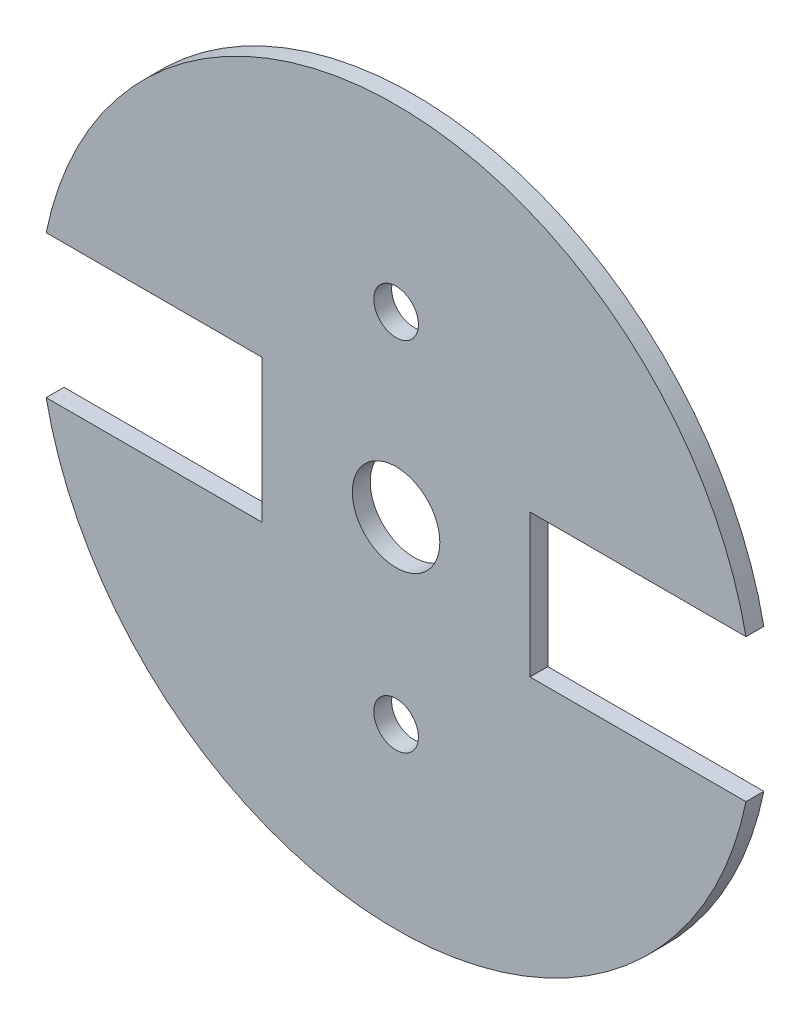
ISO-10303-21;
HEADER;
FILE_DESCRIPTION(('STEP AP214'),'2;1');
FILE_NAME('part.step','',(''),(''),'','','');
FILE_SCHEMA(('AUTOMOTIVE_DESIGN { 1 0 10303 214 1 1 1 1 }'));
ENDSEC;
DATA;
#1=APPLICATION_CONTEXT('core data for automotive mechanical design processes');
#2=APPLICATION_PROTOCOL_DEFINITION('international standard','automotive_design',2000,#1);
#3=PRODUCT_CONTEXT('',#1,'mechanical');
#4=PRODUCT('Part','Part','',(#3));
#5=PRODUCT_RELATED_PRODUCT_CATEGORY('part','',(#4));
#6=PRODUCT_DEFINITION_FORMATION('','',#4);
#7=PRODUCT_DEFINITION_CONTEXT('part definition',#1,'design');
#8=PRODUCT_DEFINITION('design','',#6,#7);
#9=PRODUCT_DEFINITION_SHAPE('','',#8);
#10=(LENGTH_UNIT() NAMED_UNIT(*) SI_UNIT(.MILLI.,.METRE.));
#11=(NAMED_UNIT(*) PLANE_ANGLE_UNIT() SI_UNIT($,.RADIAN.));
#12=(NAMED_UNIT(*) SI_UNIT($,.STERADIAN.) SOLID_ANGLE_UNIT());
#13=UNCERTAINTY_MEASURE_WITH_UNIT(LENGTH_MEASURE(1.E-05),#10,'distance_accuracy_value','');
#14=(GEOMETRIC_REPRESENTATION_CONTEXT(3) GLOBAL_UNCERTAINTY_ASSIGNED_CONTEXT((#13)) GLOBAL_UNIT_ASSIGNED_CONTEXT((#10,
#11,#12)) REPRESENTATION_CONTEXT('',''));
#15=CARTESIAN_POINT('',(0.,0.,0.));
#16=DIRECTION('',(0.,0.,1.));
#17=DIRECTION('',(1.,0.,0.));
#18=AXIS2_PLACEMENT_3D('',#15,#16,#17);
#19=CARTESIAN_POINT('',(0.,0.,2.));
#20=DIRECTION('',(0.,0.,1.));
#21=DIRECTION('',(1.,0.,0.));
#22=AXIS2_PLACEMENT_3D('',#19,#20,#21);
#23=PLANE('',#22);
#24=CARTESIAN_POINT('',(0.,19.9087203247168,2.));
#25=DIRECTION('',(0.,0.,1.));
#26=DIRECTION('',(1.,0.,0.));
#27=AXIS2_PLACEMENT_3D('',#24,#25,#26);
#28=CIRCLE('',#27,2.5);
#29=CARTESIAN_POINT('',(2.5,19.9087203247168,2.));
#30=VERTEX_POINT('',#29);
#31=EDGE_CURVE('E182',#30,#30,#28,.T.);
#32=ORIENTED_EDGE('',*,*,#31,.F.);
#33=EDGE_LOOP('',(#32));
#34=FACE_BOUND('',#33,.T.);
#35=CARTESIAN_POINT('',(0.,0.,2.));
#36=DIRECTION('',(0.,0.,1.));
#37=DIRECTION('',(1.,0.,0.));
#38=AXIS2_PLACEMENT_3D('',#35,#36,#37);
#39=CIRCLE('',#38,40.);
#40=CARTESIAN_POINT('',(39.1918358845309,8.,2.));
#41=VERTEX_POINT('',#40);
#42=CARTESIAN_POINT('',(-39.1918358845309,8.,2.));
#43=VERTEX_POINT('',#42);
#44=EDGE_CURVE('E145',#41,#43,#39,.T.);
#45=ORIENTED_EDGE('',*,*,#44,.T.);
#46=DIRECTION('',(1.,0.,0.));
#47=VECTOR('',#46,1.);
#48=CARTESIAN_POINT('',(-15.,8.,2.));
#49=LINE('',#48,#47);
#50=CARTESIAN_POINT('',(-15.,8.,2.));
#51=VERTEX_POINT('',#50);
#52=EDGE_CURVE('E93',#43,#51,#49,.T.);
#53=ORIENTED_EDGE('',*,*,#52,.T.);
#54=DIRECTION('',(0.,-1.,0.));
#55=VECTOR('',#54,1.);
#56=CARTESIAN_POINT('',(-15.,8.,2.));
#57=LINE('',#56,#55);
#58=CARTESIAN_POINT('',(-15.,-8.,2.));
#59=VERTEX_POINT('',#58);
#60=EDGE_CURVE('E160',#51,#59,#57,.T.);
#61=ORIENTED_EDGE('',*,*,#60,.T.);
#62=DIRECTION('',(-1.,0.,0.));
#63=VECTOR('',#62,1.);
#64=CARTESIAN_POINT('',(-15.,-8.,2.));
#65=LINE('',#64,#63);
#66=CARTESIAN_POINT('',(-39.1918358845309,-7.99999999999998,2.));
#67=VERTEX_POINT('',#66);
#68=EDGE_CURVE('E173',#59,#67,#65,.T.);
#69=ORIENTED_EDGE('',*,*,#68,.T.);
#70=CARTESIAN_POINT('',(0.,0.,2.));
#71=DIRECTION('',(0.,0.,1.));
#72=DIRECTION('',(1.,0.,0.));
#73=AXIS2_PLACEMENT_3D('',#70,#71,#72);
#74=CIRCLE('',#73,40.);
#75=CARTESIAN_POINT('',(39.1918358845309,-8.,2.));
#76=VERTEX_POINT('',#75);
#77=EDGE_CURVE('E112',#67,#76,#74,.T.);
#78=ORIENTED_EDGE('',*,*,#77,.T.);
#79=DIRECTION('',(-1.,0.,0.));
#80=VECTOR('',#79,1.);
#81=CARTESIAN_POINT('',(15.,-8.,2.));
#82=LINE('',#81,#80);
#83=CARTESIAN_POINT('',(15.,-8.,2.));
#84=VERTEX_POINT('',#83);
#85=EDGE_CURVE('E106',#76,#84,#82,.T.);
#86=ORIENTED_EDGE('',*,*,#85,.T.);
#87=DIRECTION('',(0.,1.,0.));
#88=VECTOR('',#87,1.);
#89=CARTESIAN_POINT('',(15.,8.,2.));
#90=LINE('',#89,#88);
#91=CARTESIAN_POINT('',(15.,8.,2.));
#92=VERTEX_POINT('',#91);
#93=EDGE_CURVE('E110',#84,#92,#90,.T.);
#94=ORIENTED_EDGE('',*,*,#93,.T.);
#95=DIRECTION('',(1.,0.,0.));
#96=VECTOR('',#95,1.);
#97=CARTESIAN_POINT('',(15.,8.,2.));
#98=LINE('',#97,#96);
#99=EDGE_CURVE('E50',#92,#41,#98,.T.);
#100=ORIENTED_EDGE('',*,*,#99,.T.);
#101=EDGE_LOOP('',(#45,#53,#61,#69,#78,#86,#94,#100));
#102=FACE_BOUND('',#101,.T.);
#103=CARTESIAN_POINT('',(0.,0.,2.));
#104=DIRECTION('',(0.,0.,1.));
#105=DIRECTION('',(1.,0.,0.));
#106=AXIS2_PLACEMENT_3D('',#103,#104,#105);
#107=CIRCLE('',#106,4.9);
#108=CARTESIAN_POINT('',(4.9,0.,2.));
#109=VERTEX_POINT('',#108);
#110=EDGE_CURVE('E134',#109,#109,#107,.T.);
#111=ORIENTED_EDGE('',*,*,#110,.F.);
#112=EDGE_LOOP('',(#111));
#113=FACE_BOUND('',#112,.T.);
#114=CARTESIAN_POINT('',(0.,-20.0912796752832,2.));
#115=DIRECTION('',(0.,0.,1.));
#116=DIRECTION('',(1.,0.,0.));
#117=AXIS2_PLACEMENT_3D('',#114,#115,#116);
#118=CIRCLE('',#117,2.5);
#119=CARTESIAN_POINT('',(2.5,-20.0912796752832,2.));
#120=VERTEX_POINT('',#119);
#121=EDGE_CURVE('E188',#120,#120,#118,.T.);
#122=ORIENTED_EDGE('',*,*,#121,.F.);
#123=EDGE_LOOP('',(#122));
#124=FACE_BOUND('',#123,.T.);
#125=ADVANCED_FACE('F33',(#34,#102,#113,#124),#23,.T.);
#126=CARTESIAN_POINT('',(0.,0.,0.));
#127=DIRECTION('',(0.,0.,1.));
#128=DIRECTION('',(1.,0.,0.));
#129=AXIS2_PLACEMENT_3D('',#126,#127,#128);
#130=PLANE('',#129);
#131=CARTESIAN_POINT('',(0.,19.9087203247168,0.));
#132=DIRECTION('',(0.,0.,1.));
#133=DIRECTION('',(1.,0.,0.));
#134=AXIS2_PLACEMENT_3D('',#131,#132,#133);
#135=CIRCLE('',#134,2.5);
#136=CARTESIAN_POINT('',(2.5,19.9087203247168,0.));
#137=VERTEX_POINT('',#136);
#138=EDGE_CURVE('E185',#137,#137,#135,.T.);
#139=ORIENTED_EDGE('',*,*,#138,.T.);
#140=EDGE_LOOP('',(#139));
#141=FACE_BOUND('',#140,.T.);
#142=CARTESIAN_POINT('',(0.,0.,0.));
#143=DIRECTION('',(0.,0.,1.));
#144=DIRECTION('',(1.,0.,0.));
#145=AXIS2_PLACEMENT_3D('',#142,#143,#144);
#146=CIRCLE('',#145,40.);
#147=CARTESIAN_POINT('',(39.1918358845309,8.,0.));
#148=VERTEX_POINT('',#147);
#149=CARTESIAN_POINT('',(-39.1918358845309,8.,0.));
#150=VERTEX_POINT('',#149);
#151=EDGE_CURVE('E130',#148,#150,#146,.T.);
#152=ORIENTED_EDGE('',*,*,#151,.F.);
#153=DIRECTION('',(1.,0.,0.));
#154=VECTOR('',#153,1.);
#155=CARTESIAN_POINT('',(15.,8.,0.));
#156=LINE('',#155,#154);
#157=CARTESIAN_POINT('',(15.,8.,0.));
#158=VERTEX_POINT('',#157);
#159=EDGE_CURVE('E85',#158,#148,#156,.T.);
#160=ORIENTED_EDGE('',*,*,#159,.F.);
#161=DIRECTION('',(0.,1.,0.));
#162=VECTOR('',#161,1.);
#163=CARTESIAN_POINT('',(15.,8.,0.));
#164=LINE('',#163,#162);
#165=CARTESIAN_POINT('',(15.,-8.,0.));
#166=VERTEX_POINT('',#165);
#167=EDGE_CURVE('E79',#166,#158,#164,.T.);
#168=ORIENTED_EDGE('',*,*,#167,.F.);
#169=DIRECTION('',(-1.,0.,0.));
#170=VECTOR('',#169,1.);
#171=CARTESIAN_POINT('',(15.,-8.,0.));
#172=LINE('',#171,#170);
#173=CARTESIAN_POINT('',(39.1918358845309,-8.,0.));
#174=VERTEX_POINT('',#173);
#175=EDGE_CURVE('E120',#174,#166,#172,.T.);
#176=ORIENTED_EDGE('',*,*,#175,.F.);
#177=CARTESIAN_POINT('',(0.,0.,0.));
#178=DIRECTION('',(0.,0.,1.));
#179=DIRECTION('',(1.,0.,0.));
#180=AXIS2_PLACEMENT_3D('',#177,#178,#179);
#181=CIRCLE('',#180,40.);
#182=CARTESIAN_POINT('',(-39.1918358845309,-7.99999999999998,0.));
#183=VERTEX_POINT('',#182);
#184=EDGE_CURVE('E140',#183,#174,#181,.T.);
#185=ORIENTED_EDGE('',*,*,#184,.F.);
#186=DIRECTION('',(-1.,0.,0.));
#187=VECTOR('',#186,1.);
#188=CARTESIAN_POINT('',(-15.,-8.,0.));
#189=LINE('',#188,#187);
#190=CARTESIAN_POINT('',(-15.,-8.,0.));
#191=VERTEX_POINT('',#190);
#192=EDGE_CURVE('E138',#191,#183,#189,.T.);
#193=ORIENTED_EDGE('',*,*,#192,.F.);
#194=DIRECTION('',(0.,-1.,0.));
#195=VECTOR('',#194,1.);
#196=CARTESIAN_POINT('',(-15.,8.,0.));
#197=LINE('',#196,#195);
#198=CARTESIAN_POINT('',(-15.,8.,0.));
#199=VERTEX_POINT('',#198);
#200=EDGE_CURVE('E136',#199,#191,#197,.T.);
#201=ORIENTED_EDGE('',*,*,#200,.F.);
#202=DIRECTION('',(1.,0.,0.));
#203=VECTOR('',#202,1.);
#204=CARTESIAN_POINT('',(-15.,8.,0.));
#205=LINE('',#204,#203);
#206=EDGE_CURVE('E133',#150,#199,#205,.T.);
#207=ORIENTED_EDGE('',*,*,#206,.F.);
#208=EDGE_LOOP('',(#152,#160,#168,#176,#185,#193,#201,#207));
#209=FACE_BOUND('',#208,.T.);
#210=CARTESIAN_POINT('',(0.,0.,0.));
#211=DIRECTION('',(0.,0.,1.));
#212=DIRECTION('',(1.,0.,0.));
#213=AXIS2_PLACEMENT_3D('',#210,#211,#212);
#214=CIRCLE('',#213,4.9);
#215=CARTESIAN_POINT('',(4.9,0.,0.));
#216=VERTEX_POINT('',#215);
#217=EDGE_CURVE('E179',#216,#216,#214,.T.);
#218=ORIENTED_EDGE('',*,*,#217,.T.);
#219=EDGE_LOOP('',(#218));
#220=FACE_BOUND('',#219,.T.);
#221=CARTESIAN_POINT('',(0.,-20.0912796752832,0.));
#222=DIRECTION('',(0.,0.,1.));
#223=DIRECTION('',(1.,0.,0.));
#224=AXIS2_PLACEMENT_3D('',#221,#222,#223);
#225=CIRCLE('',#224,2.5);
#226=CARTESIAN_POINT('',(2.5,-20.0912796752832,0.));
#227=VERTEX_POINT('',#226);
#228=EDGE_CURVE('E191',#227,#227,#225,.T.);
#229=ORIENTED_EDGE('',*,*,#228,.T.);
#230=EDGE_LOOP('',(#229));
#231=FACE_BOUND('',#230,.T.);
#232=ADVANCED_FACE('F164',(#141,#209,#220,#231),#130,.F.);
#233=CARTESIAN_POINT('',(0.,0.,2.));
#234=DIRECTION('',(0.,0.,-1.));
#235=DIRECTION('',(-1.,0.,0.));
#236=AXIS2_PLACEMENT_3D('',#233,#234,#235);
#237=CYLINDRICAL_SURFACE('',#236,40.);
#238=ORIENTED_EDGE('',*,*,#151,.T.);
#239=DIRECTION('',(0.,0.,-1.));
#240=VECTOR('',#239,1.);
#241=CARTESIAN_POINT('',(-39.1918358845309,8.,2.));
#242=LINE('',#241,#240);
#243=EDGE_CURVE('E11',#43,#150,#242,.T.);
#244=ORIENTED_EDGE('',*,*,#243,.F.);
#245=ORIENTED_EDGE('',*,*,#44,.F.);
#246=DIRECTION('',(0.,0.,-1.));
#247=VECTOR('',#246,1.);
#248=CARTESIAN_POINT('',(39.1918358845309,8.,2.));
#249=LINE('',#248,#247);
#250=EDGE_CURVE('E126',#41,#148,#249,.T.);
#251=ORIENTED_EDGE('',*,*,#250,.T.);
#252=EDGE_LOOP('',(#238,#244,#245,#251));
#253=FACE_BOUND('',#252,.T.);
#254=ADVANCED_FACE('F35',(#253),#237,.T.);
#255=CARTESIAN_POINT('',(-15.,8.,2.));
#256=DIRECTION('',(0.,1.,0.));
#257=DIRECTION('',(0.,0.,1.));
#258=AXIS2_PLACEMENT_3D('',#255,#256,#257);
#259=PLANE('',#258);
#260=ORIENTED_EDGE('',*,*,#206,.T.);
#261=DIRECTION('',(0.,0.,-1.));
#262=VECTOR('',#261,1.);
#263=CARTESIAN_POINT('',(-15.,8.,2.));
#264=LINE('',#263,#262);
#265=EDGE_CURVE('E42',#51,#199,#264,.T.);
#266=ORIENTED_EDGE('',*,*,#265,.F.);
#267=ORIENTED_EDGE('',*,*,#52,.F.);
#268=ORIENTED_EDGE('',*,*,#243,.T.);
#269=EDGE_LOOP('',(#260,#266,#267,#268));
#270=FACE_BOUND('',#269,.T.);
#271=ADVANCED_FACE('F225',(#270),#259,.F.);
#272=CARTESIAN_POINT('',(-15.,8.,2.));
#273=DIRECTION('',(1.,0.,0.));
#274=DIRECTION('',(0.,0.,-1.));
#275=AXIS2_PLACEMENT_3D('',#272,#273,#274);
#276=PLANE('',#275);
#277=ORIENTED_EDGE('',*,*,#200,.T.);
#278=DIRECTION('',(0.,0.,-1.));
#279=VECTOR('',#278,1.);
#280=CARTESIAN_POINT('',(-15.,-8.,2.));
#281=LINE('',#280,#279);
#282=EDGE_CURVE('E152',#59,#191,#281,.T.);
#283=ORIENTED_EDGE('',*,*,#282,.F.);
#284=ORIENTED_EDGE('',*,*,#60,.F.);
#285=ORIENTED_EDGE('',*,*,#265,.T.);
#286=EDGE_LOOP('',(#277,#283,#284,#285));
#287=FACE_BOUND('',#286,.T.);
#288=ADVANCED_FACE('F158',(#287),#276,.F.);
#289=CARTESIAN_POINT('',(-15.,-8.,2.));
#290=DIRECTION('',(0.,-1.,0.));
#291=DIRECTION('',(0.,0.,-1.));
#292=AXIS2_PLACEMENT_3D('',#289,#290,#291);
#293=PLANE('',#292);
#294=ORIENTED_EDGE('',*,*,#192,.T.);
#295=DIRECTION('',(0.,0.,-1.));
#296=VECTOR('',#295,1.);
#297=CARTESIAN_POINT('',(-39.1918358845309,-7.99999999999998,2.));
#298=LINE('',#297,#296);
#299=EDGE_CURVE('E149',#67,#183,#298,.T.);
#300=ORIENTED_EDGE('',*,*,#299,.F.);
#301=ORIENTED_EDGE('',*,*,#68,.F.);
#302=ORIENTED_EDGE('',*,*,#282,.T.);
#303=EDGE_LOOP('',(#294,#300,#301,#302));
#304=FACE_BOUND('',#303,.T.);
#305=ADVANCED_FACE('F169',(#304),#293,.F.);
#306=CARTESIAN_POINT('',(0.,0.,2.));
#307=DIRECTION('',(0.,0.,-1.));
#308=DIRECTION('',(-1.,0.,0.));
#309=AXIS2_PLACEMENT_3D('',#306,#307,#308);
#310=CYLINDRICAL_SURFACE('',#309,40.);
#311=ORIENTED_EDGE('',*,*,#184,.T.);
#312=DIRECTION('',(0.,0.,-1.));
#313=VECTOR('',#312,1.);
#314=CARTESIAN_POINT('',(39.1918358845309,-8.,2.));
#315=LINE('',#314,#313);
#316=EDGE_CURVE('E121',#76,#174,#315,.T.);
#317=ORIENTED_EDGE('',*,*,#316,.F.);
#318=ORIENTED_EDGE('',*,*,#77,.F.);
#319=ORIENTED_EDGE('',*,*,#299,.T.);
#320=EDGE_LOOP('',(#311,#317,#318,#319));
#321=FACE_BOUND('',#320,.T.);
#322=ADVANCED_FACE('F172',(#321),#310,.T.);
#323=CARTESIAN_POINT('',(15.,-8.,2.));
#324=DIRECTION('',(0.,-1.,0.));
#325=DIRECTION('',(0.,0.,-1.));
#326=AXIS2_PLACEMENT_3D('',#323,#324,#325);
#327=PLANE('',#326);
#328=ORIENTED_EDGE('',*,*,#175,.T.);
#329=DIRECTION('',(0.,0.,-1.));
#330=VECTOR('',#329,1.);
#331=CARTESIAN_POINT('',(15.,-8.,2.));
#332=LINE('',#331,#330);
#333=EDGE_CURVE('E117',#84,#166,#332,.T.);
#334=ORIENTED_EDGE('',*,*,#333,.F.);
#335=ORIENTED_EDGE('',*,*,#85,.F.);
#336=ORIENTED_EDGE('',*,*,#316,.T.);
#337=EDGE_LOOP('',(#328,#334,#335,#336));
#338=FACE_BOUND('',#337,.T.);
#339=ADVANCED_FACE('F118',(#338),#327,.F.);
#340=CARTESIAN_POINT('',(15.,8.,2.));
#341=DIRECTION('',(-1.,0.,0.));
#342=DIRECTION('',(0.,0.,1.));
#343=AXIS2_PLACEMENT_3D('',#340,#341,#342);
#344=PLANE('',#343);
#345=ORIENTED_EDGE('',*,*,#167,.T.);
#346=DIRECTION('',(0.,0.,-1.));
#347=VECTOR('',#346,1.);
#348=CARTESIAN_POINT('',(15.,8.,2.));
#349=LINE('',#348,#347);
#350=EDGE_CURVE('E122',#92,#158,#349,.T.);
#351=ORIENTED_EDGE('',*,*,#350,.F.);
#352=ORIENTED_EDGE('',*,*,#93,.F.);
#353=ORIENTED_EDGE('',*,*,#333,.T.);
#354=EDGE_LOOP('',(#345,#351,#352,#353));
#355=FACE_BOUND('',#354,.T.);
#356=ADVANCED_FACE('F124',(#355),#344,.F.);
#357=CARTESIAN_POINT('',(15.,8.,2.));
#358=DIRECTION('',(0.,1.,0.));
#359=DIRECTION('',(0.,0.,1.));
#360=AXIS2_PLACEMENT_3D('',#357,#358,#359);
#361=PLANE('',#360);
#362=ORIENTED_EDGE('',*,*,#159,.T.);
#363=ORIENTED_EDGE('',*,*,#250,.F.);
#364=ORIENTED_EDGE('',*,*,#99,.F.);
#365=ORIENTED_EDGE('',*,*,#350,.T.);
#366=EDGE_LOOP('',(#362,#363,#364,#365));
#367=FACE_BOUND('',#366,.T.);
#368=ADVANCED_FACE('F213',(#367),#361,.F.);
#369=CARTESIAN_POINT('',(0.,0.,2.));
#370=DIRECTION('',(0.,0.,-1.));
#371=DIRECTION('',(-1.,0.,0.));
#372=AXIS2_PLACEMENT_3D('',#369,#370,#371);
#373=CYLINDRICAL_SURFACE('',#372,4.9);
#374=ORIENTED_EDGE('',*,*,#110,.T.);
#375=EDGE_LOOP('',(#374));
#376=FACE_BOUND('',#375,.T.);
#377=ORIENTED_EDGE('',*,*,#217,.F.);
#378=EDGE_LOOP('',(#377));
#379=FACE_BOUND('',#378,.T.);
#380=ADVANCED_FACE('F210',(#376,#379),#373,.F.);
#381=CARTESIAN_POINT('',(0.,19.9087203247168,2.));
#382=DIRECTION('',(0.,0.,-1.));
#383=DIRECTION('',(-1.,0.,0.));
#384=AXIS2_PLACEMENT_3D('',#381,#382,#383);
#385=CYLINDRICAL_SURFACE('',#384,2.5);
#386=ORIENTED_EDGE('',*,*,#31,.T.);
#387=EDGE_LOOP('',(#386));
#388=FACE_BOUND('',#387,.T.);
#389=ORIENTED_EDGE('',*,*,#138,.F.);
#390=EDGE_LOOP('',(#389));
#391=FACE_BOUND('',#390,.T.);
#392=ADVANCED_FACE('F289',(#388,#391),#385,.F.);
#393=CARTESIAN_POINT('',(0.,-20.0912796752832,2.));
#394=DIRECTION('',(0.,0.,-1.));
#395=DIRECTION('',(-1.,0.,0.));
#396=AXIS2_PLACEMENT_3D('',#393,#394,#395);
#397=CYLINDRICAL_SURFACE('',#396,2.5);
#398=ORIENTED_EDGE('',*,*,#121,.T.);
#399=EDGE_LOOP('',(#398));
#400=FACE_BOUND('',#399,.T.);
#401=ORIENTED_EDGE('',*,*,#228,.F.);
#402=EDGE_LOOP('',(#401));
#403=FACE_BOUND('',#402,.T.);
#404=ADVANCED_FACE('F197',(#400,#403),#397,.F.);
#405=CLOSED_SHELL('',(#125,#232,#254,#271,#288,#305,#322,#339,#356,#368,#380,#392,#404));
#406=MANIFOLD_SOLID_BREP('B2',#405);
#407=ADVANCED_BREP_SHAPE_REPRESENTATION('',(#18,#406),#14);
#408=SHAPE_DEFINITION_REPRESENTATION(#9,#407);
ENDSEC;
END-ISO-10303-21;
